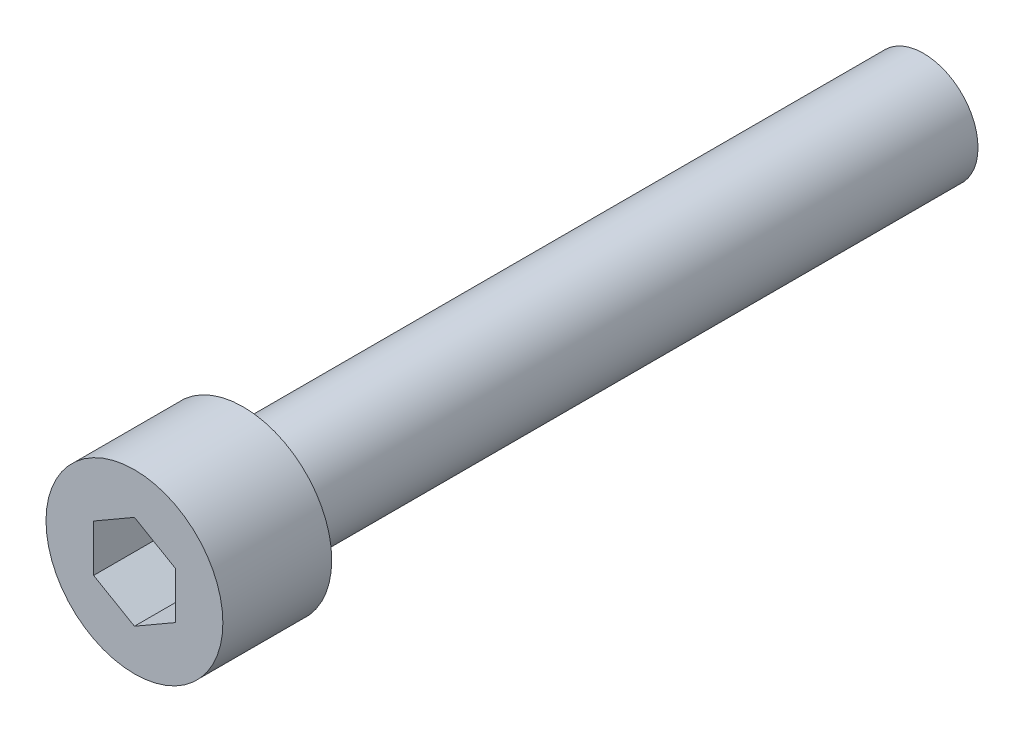
ISO-10303-21;
HEADER;
FILE_DESCRIPTION(('STEP AP214'),'2;1');
FILE_NAME('part.step','',(''),(''),'','','');
FILE_SCHEMA(('AUTOMOTIVE_DESIGN { 1 0 10303 214 1 1 1 1 }'));
ENDSEC;
DATA;
#1=APPLICATION_CONTEXT('core data for automotive mechanical design processes');
#2=APPLICATION_PROTOCOL_DEFINITION('international standard','automotive_design',2000,#1);
#3=PRODUCT_CONTEXT('',#1,'mechanical');
#4=PRODUCT('Part','Part','',(#3));
#5=PRODUCT_RELATED_PRODUCT_CATEGORY('part','',(#4));
#6=PRODUCT_DEFINITION_FORMATION('','',#4);
#7=PRODUCT_DEFINITION_CONTEXT('part definition',#1,'design');
#8=PRODUCT_DEFINITION('design','',#6,#7);
#9=PRODUCT_DEFINITION_SHAPE('','',#8);
#10=(LENGTH_UNIT() NAMED_UNIT(*) SI_UNIT(.MILLI.,.METRE.));
#11=(NAMED_UNIT(*) PLANE_ANGLE_UNIT() SI_UNIT($,.RADIAN.));
#12=(NAMED_UNIT(*) SI_UNIT($,.STERADIAN.) SOLID_ANGLE_UNIT());
#13=UNCERTAINTY_MEASURE_WITH_UNIT(LENGTH_MEASURE(1.E-05),#10,'distance_accuracy_value','');
#14=(GEOMETRIC_REPRESENTATION_CONTEXT(3) GLOBAL_UNCERTAINTY_ASSIGNED_CONTEXT((#13)) GLOBAL_UNIT_ASSIGNED_CONTEXT((#10,
#11,#12)) REPRESENTATION_CONTEXT('',''));
#15=CARTESIAN_POINT('',(0.,0.,0.));
#16=DIRECTION('',(0.,0.,1.));
#17=DIRECTION('',(1.,0.,0.));
#18=AXIS2_PLACEMENT_3D('',#15,#16,#17);
#19=CARTESIAN_POINT('',(0.,0.,0.));
#20=DIRECTION('',(0.,0.,-1.));
#21=DIRECTION('',(-1.,0.,0.));
#22=AXIS2_PLACEMENT_3D('',#19,#20,#21);
#23=PLANE('',#22);
#24=DIRECTION('',(0.866025403784439,-0.5,0.));
#25=VECTOR('',#24,1.);
#26=CARTESIAN_POINT('',(-3.,-1.73205080756888,0.));
#27=LINE('',#26,#25);
#28=CARTESIAN_POINT('',(-3.,-1.73205080756888,0.));
#29=VERTEX_POINT('',#28);
#30=CARTESIAN_POINT('',(0.,-3.46410161513776,0.));
#31=VERTEX_POINT('',#30);
#32=EDGE_CURVE('E123',#29,#31,#27,.T.);
#33=ORIENTED_EDGE('',*,*,#32,.F.);
#34=DIRECTION('',(0.,-1.,0.));
#35=VECTOR('',#34,1.);
#36=CARTESIAN_POINT('',(-3.,1.73205080756888,0.));
#37=LINE('',#36,#35);
#38=CARTESIAN_POINT('',(-3.,1.73205080756888,0.));
#39=VERTEX_POINT('',#38);
#40=EDGE_CURVE('E49',#39,#29,#37,.T.);
#41=ORIENTED_EDGE('',*,*,#40,.F.);
#42=DIRECTION('',(-0.866025403784439,-0.5,0.));
#43=VECTOR('',#42,1.);
#44=CARTESIAN_POINT('',(0.,3.46410161513776,0.));
#45=LINE('',#44,#43);
#46=CARTESIAN_POINT('',(0.,3.46410161513776,0.));
#47=VERTEX_POINT('',#46);
#48=EDGE_CURVE('E132',#47,#39,#45,.T.);
#49=ORIENTED_EDGE('',*,*,#48,.F.);
#50=DIRECTION('',(-0.866025403784439,0.5,0.));
#51=VECTOR('',#50,1.);
#52=CARTESIAN_POINT('',(3.,1.73205080756888,0.));
#53=LINE('',#52,#51);
#54=CARTESIAN_POINT('',(3.,1.73205080756888,0.));
#55=VERTEX_POINT('',#54);
#56=EDGE_CURVE('E130',#55,#47,#53,.T.);
#57=ORIENTED_EDGE('',*,*,#56,.F.);
#58=DIRECTION('',(0.,1.,0.));
#59=VECTOR('',#58,1.);
#60=CARTESIAN_POINT('',(3.,-1.73205080756888,0.));
#61=LINE('',#60,#59);
#62=CARTESIAN_POINT('',(3.,-1.73205080756888,0.));
#63=VERTEX_POINT('',#62);
#64=EDGE_CURVE('E97',#63,#55,#61,.T.);
#65=ORIENTED_EDGE('',*,*,#64,.F.);
#66=DIRECTION('',(0.866025403784439,0.5,0.));
#67=VECTOR('',#66,1.);
#68=CARTESIAN_POINT('',(0.,-3.46410161513776,0.));
#69=LINE('',#68,#67);
#70=EDGE_CURVE('E126',#31,#63,#69,.T.);
#71=ORIENTED_EDGE('',*,*,#70,.F.);
#72=EDGE_LOOP('',(#33,#41,#49,#57,#65,#71));
#73=FACE_BOUND('',#72,.T.);
#74=CARTESIAN_POINT('',(0.,0.,0.));
#75=DIRECTION('',(0.,0.,1.));
#76=DIRECTION('',(1.,0.,0.));
#77=AXIS2_PLACEMENT_3D('',#74,#75,#76);
#78=CIRCLE('',#77,6.5);
#79=CARTESIAN_POINT('',(6.5,0.,0.));
#80=VERTEX_POINT('',#79);
#81=EDGE_CURVE('E11',#80,#80,#78,.T.);
#82=ORIENTED_EDGE('',*,*,#81,.T.);
#83=EDGE_LOOP('',(#82));
#84=FACE_BOUND('',#83,.T.);
#85=ADVANCED_FACE('F35',(#73,#84),#23,.F.);
#86=CARTESIAN_POINT('',(0.,0.,0.));
#87=DIRECTION('',(0.,0.,1.));
#88=DIRECTION('',(1.,0.,0.));
#89=AXIS2_PLACEMENT_3D('',#86,#87,#88);
#90=CYLINDRICAL_SURFACE('',#89,6.5);
#91=ORIENTED_EDGE('',*,*,#81,.F.);
#92=EDGE_LOOP('',(#91));
#93=FACE_BOUND('',#92,.T.);
#94=CARTESIAN_POINT('',(0.,0.,-8.));
#95=DIRECTION('',(0.,0.,1.));
#96=DIRECTION('',(1.,0.,0.));
#97=AXIS2_PLACEMENT_3D('',#94,#95,#96);
#98=CIRCLE('',#97,6.5);
#99=CARTESIAN_POINT('',(6.5,0.,-8.));
#100=VERTEX_POINT('',#99);
#101=EDGE_CURVE('E42',#100,#100,#98,.T.);
#102=ORIENTED_EDGE('',*,*,#101,.T.);
#103=EDGE_LOOP('',(#102));
#104=FACE_BOUND('',#103,.T.);
#105=ADVANCED_FACE('F149',(#93,#104),#90,.T.);
#106=CARTESIAN_POINT('',(0.,6.5,-8.));
#107=DIRECTION('',(0.,0.,1.));
#108=DIRECTION('',(1.,0.,0.));
#109=AXIS2_PLACEMENT_3D('',#106,#107,#108);
#110=PLANE('',#109);
#111=ORIENTED_EDGE('',*,*,#101,.F.);
#112=EDGE_LOOP('',(#111));
#113=FACE_BOUND('',#112,.T.);
#114=CARTESIAN_POINT('',(0.,0.,-8.));
#115=DIRECTION('',(0.,0.,1.));
#116=DIRECTION('',(1.,0.,0.));
#117=AXIS2_PLACEMENT_3D('',#114,#115,#116);
#118=CIRCLE('',#117,4.);
#119=CARTESIAN_POINT('',(4.,0.,-8.));
#120=VERTEX_POINT('',#119);
#121=EDGE_CURVE('E144',#120,#120,#118,.T.);
#122=ORIENTED_EDGE('',*,*,#121,.T.);
#123=EDGE_LOOP('',(#122));
#124=FACE_BOUND('',#123,.T.);
#125=ADVANCED_FACE('F151',(#113,#124),#110,.F.);
#126=CARTESIAN_POINT('',(0.,0.,0.));
#127=DIRECTION('',(0.,0.,1.));
#128=DIRECTION('',(1.,0.,0.));
#129=AXIS2_PLACEMENT_3D('',#126,#127,#128);
#130=CYLINDRICAL_SURFACE('',#129,4.);
#131=ORIENTED_EDGE('',*,*,#121,.F.);
#132=EDGE_LOOP('',(#131));
#133=FACE_BOUND('',#132,.T.);
#134=CARTESIAN_POINT('',(0.,0.,-58.));
#135=DIRECTION('',(0.,0.,1.));
#136=DIRECTION('',(1.,0.,0.));
#137=AXIS2_PLACEMENT_3D('',#134,#135,#136);
#138=CIRCLE('',#137,4.);
#139=CARTESIAN_POINT('',(4.,0.,-58.));
#140=VERTEX_POINT('',#139);
#141=EDGE_CURVE('E136',#140,#140,#138,.T.);
#142=ORIENTED_EDGE('',*,*,#141,.T.);
#143=EDGE_LOOP('',(#142));
#144=FACE_BOUND('',#143,.T.);
#145=ADVANCED_FACE('F154',(#133,#144),#130,.T.);
#146=CARTESIAN_POINT('',(0.,4.,-58.));
#147=DIRECTION('',(0.,0.,1.));
#148=DIRECTION('',(1.,0.,0.));
#149=AXIS2_PLACEMENT_3D('',#146,#147,#148);
#150=PLANE('',#149);
#151=ORIENTED_EDGE('',*,*,#141,.F.);
#152=EDGE_LOOP('',(#151));
#153=FACE_BOUND('',#152,.T.);
#154=ADVANCED_FACE('F160',(#153),#150,.F.);
#155=CARTESIAN_POINT('',(-3.,1.73205080756888,-6.));
#156=DIRECTION('',(-1.,0.,0.));
#157=DIRECTION('',(0.,0.,1.));
#158=AXIS2_PLACEMENT_3D('',#155,#156,#157);
#159=PLANE('',#158);
#160=ORIENTED_EDGE('',*,*,#40,.T.);
#161=DIRECTION('',(0.,0.,1.));
#162=VECTOR('',#161,1.);
#163=CARTESIAN_POINT('',(-3.,-1.73205080756888,-6.));
#164=LINE('',#163,#162);
#165=CARTESIAN_POINT('',(-3.,-1.73205080756888,-6.));
#166=VERTEX_POINT('',#165);
#167=EDGE_CURVE('E79',#166,#29,#164,.T.);
#168=ORIENTED_EDGE('',*,*,#167,.F.);
#169=DIRECTION('',(0.,-1.,0.));
#170=VECTOR('',#169,1.);
#171=CARTESIAN_POINT('',(-3.,1.73205080756888,-6.));
#172=LINE('',#171,#170);
#173=CARTESIAN_POINT('',(-3.,1.73205080756888,-6.));
#174=VERTEX_POINT('',#173);
#175=EDGE_CURVE('E134',#174,#166,#172,.T.);
#176=ORIENTED_EDGE('',*,*,#175,.F.);
#177=DIRECTION('',(0.,0.,1.));
#178=VECTOR('',#177,1.);
#179=CARTESIAN_POINT('',(-3.,1.73205080756888,-6.));
#180=LINE('',#179,#178);
#181=EDGE_CURVE('E57',#174,#39,#180,.T.);
#182=ORIENTED_EDGE('',*,*,#181,.T.);
#183=EDGE_LOOP('',(#160,#168,#176,#182));
#184=FACE_BOUND('',#183,.T.);
#185=ADVANCED_FACE('F165',(#184),#159,.F.);
#186=CARTESIAN_POINT('',(0.,3.46410161513776,-6.));
#187=DIRECTION('',(-0.5,0.866025403784439,0.));
#188=DIRECTION('',(-0.866025403784439,-0.5,0.));
#189=AXIS2_PLACEMENT_3D('',#186,#187,#188);
#190=PLANE('',#189);
#191=ORIENTED_EDGE('',*,*,#48,.T.);
#192=ORIENTED_EDGE('',*,*,#181,.F.);
#193=DIRECTION('',(-0.866025403784439,-0.5,0.));
#194=VECTOR('',#193,1.);
#195=CARTESIAN_POINT('',(0.,3.46410161513776,-6.));
#196=LINE('',#195,#194);
#197=CARTESIAN_POINT('',(0.,3.46410161513776,-6.));
#198=VERTEX_POINT('',#197);
#199=EDGE_CURVE('E109',#198,#174,#196,.T.);
#200=ORIENTED_EDGE('',*,*,#199,.F.);
#201=DIRECTION('',(0.,0.,1.));
#202=VECTOR('',#201,1.);
#203=CARTESIAN_POINT('',(0.,3.46410161513776,-6.));
#204=LINE('',#203,#202);
#205=EDGE_CURVE('E101',#198,#47,#204,.T.);
#206=ORIENTED_EDGE('',*,*,#205,.T.);
#207=EDGE_LOOP('',(#191,#192,#200,#206));
#208=FACE_BOUND('',#207,.T.);
#209=ADVANCED_FACE('F170',(#208),#190,.F.);
#210=CARTESIAN_POINT('',(3.,1.73205080756888,-6.));
#211=DIRECTION('',(0.5,0.866025403784439,0.));
#212=DIRECTION('',(-0.866025403784439,0.5,0.));
#213=AXIS2_PLACEMENT_3D('',#210,#211,#212);
#214=PLANE('',#213);
#215=ORIENTED_EDGE('',*,*,#56,.T.);
#216=ORIENTED_EDGE('',*,*,#205,.F.);
#217=DIRECTION('',(-0.866025403784439,0.5,0.));
#218=VECTOR('',#217,1.);
#219=CARTESIAN_POINT('',(3.,1.73205080756888,-6.));
#220=LINE('',#219,#218);
#221=CARTESIAN_POINT('',(3.,1.73205080756888,-6.));
#222=VERTEX_POINT('',#221);
#223=EDGE_CURVE('E105',#222,#198,#220,.T.);
#224=ORIENTED_EDGE('',*,*,#223,.F.);
#225=DIRECTION('',(0.,0.,1.));
#226=VECTOR('',#225,1.);
#227=CARTESIAN_POINT('',(3.,1.73205080756888,-6.));
#228=LINE('',#227,#226);
#229=EDGE_CURVE('E90',#222,#55,#228,.T.);
#230=ORIENTED_EDGE('',*,*,#229,.T.);
#231=EDGE_LOOP('',(#215,#216,#224,#230));
#232=FACE_BOUND('',#231,.T.);
#233=ADVANCED_FACE('F106',(#232),#214,.F.);
#234=CARTESIAN_POINT('',(3.,-1.73205080756888,-6.));
#235=DIRECTION('',(1.,0.,0.));
#236=DIRECTION('',(0.,1.,0.));
#237=AXIS2_PLACEMENT_3D('',#234,#235,#236);
#238=PLANE('',#237);
#239=ORIENTED_EDGE('',*,*,#64,.T.);
#240=ORIENTED_EDGE('',*,*,#229,.F.);
#241=DIRECTION('',(0.,1.,0.));
#242=VECTOR('',#241,1.);
#243=CARTESIAN_POINT('',(3.,-1.73205080756888,-6.));
#244=LINE('',#243,#242);
#245=CARTESIAN_POINT('',(3.,-1.73205080756888,-6.));
#246=VERTEX_POINT('',#245);
#247=EDGE_CURVE('E94',#246,#222,#244,.T.);
#248=ORIENTED_EDGE('',*,*,#247,.F.);
#249=DIRECTION('',(0.,0.,1.));
#250=VECTOR('',#249,1.);
#251=CARTESIAN_POINT('',(3.,-1.73205080756888,-6.));
#252=LINE('',#251,#250);
#253=EDGE_CURVE('E102',#246,#63,#252,.T.);
#254=ORIENTED_EDGE('',*,*,#253,.T.);
#255=EDGE_LOOP('',(#239,#240,#248,#254));
#256=FACE_BOUND('',#255,.T.);
#257=ADVANCED_FACE('F92',(#256),#238,.F.);
#258=CARTESIAN_POINT('',(0.,-3.46410161513776,-6.));
#259=DIRECTION('',(0.5,-0.866025403784438,0.));
#260=DIRECTION('',(0.866025403784439,0.5,0.));
#261=AXIS2_PLACEMENT_3D('',#258,#259,#260);
#262=PLANE('',#261);
#263=ORIENTED_EDGE('',*,*,#70,.T.);
#264=ORIENTED_EDGE('',*,*,#253,.F.);
#265=DIRECTION('',(0.866025403784439,0.5,0.));
#266=VECTOR('',#265,1.);
#267=CARTESIAN_POINT('',(0.,-3.46410161513776,-6.));
#268=LINE('',#267,#266);
#269=CARTESIAN_POINT('',(0.,-3.46410161513776,-6.));
#270=VERTEX_POINT('',#269);
#271=EDGE_CURVE('E115',#270,#246,#268,.T.);
#272=ORIENTED_EDGE('',*,*,#271,.F.);
#273=DIRECTION('',(0.,0.,1.));
#274=VECTOR('',#273,1.);
#275=CARTESIAN_POINT('',(0.,-3.46410161513776,-6.));
#276=LINE('',#275,#274);
#277=EDGE_CURVE('E139',#270,#31,#276,.T.);
#278=ORIENTED_EDGE('',*,*,#277,.T.);
#279=EDGE_LOOP('',(#263,#264,#272,#278));
#280=FACE_BOUND('',#279,.T.);
#281=ADVANCED_FACE('F196',(#280),#262,.F.);
#282=CARTESIAN_POINT('',(-3.,-1.73205080756888,-6.));
#283=DIRECTION('',(-0.5,-0.866025403784438,0.));
#284=DIRECTION('',(0.866025403784439,-0.5,0.));
#285=AXIS2_PLACEMENT_3D('',#282,#283,#284);
#286=PLANE('',#285);
#287=ORIENTED_EDGE('',*,*,#32,.T.);
#288=ORIENTED_EDGE('',*,*,#277,.F.);
#289=DIRECTION('',(0.866025403784439,-0.5,0.));
#290=VECTOR('',#289,1.);
#291=CARTESIAN_POINT('',(-3.,-1.73205080756888,-6.));
#292=LINE('',#291,#290);
#293=EDGE_CURVE('E117',#166,#270,#292,.T.);
#294=ORIENTED_EDGE('',*,*,#293,.F.);
#295=ORIENTED_EDGE('',*,*,#167,.T.);
#296=EDGE_LOOP('',(#287,#288,#294,#295));
#297=FACE_BOUND('',#296,.T.);
#298=ADVANCED_FACE('F184',(#297),#286,.F.);
#299=CARTESIAN_POINT('',(0.,0.,-6.));
#300=DIRECTION('',(0.,0.,1.));
#301=DIRECTION('',(1.,0.,0.));
#302=AXIS2_PLACEMENT_3D('',#299,#300,#301);
#303=PLANE('',#302);
#304=ORIENTED_EDGE('',*,*,#175,.T.);
#305=ORIENTED_EDGE('',*,*,#293,.T.);
#306=ORIENTED_EDGE('',*,*,#271,.T.);
#307=ORIENTED_EDGE('',*,*,#247,.T.);
#308=ORIENTED_EDGE('',*,*,#223,.T.);
#309=ORIENTED_EDGE('',*,*,#199,.T.);
#310=EDGE_LOOP('',(#304,#305,#306,#307,#308,#309));
#311=FACE_BOUND('',#310,.T.);
#312=ADVANCED_FACE('F112',(#311),#303,.T.);
#313=CLOSED_SHELL('',(#85,#105,#125,#145,#154,#185,#209,#233,#257,#281,#298,#312));
#314=MANIFOLD_SOLID_BREP('B2',#313);
#315=ADVANCED_BREP_SHAPE_REPRESENTATION('',(#18,#314),#14);
#316=SHAPE_DEFINITION_REPRESENTATION(#9,#315);
ENDSEC;
END-ISO-10303-21;
